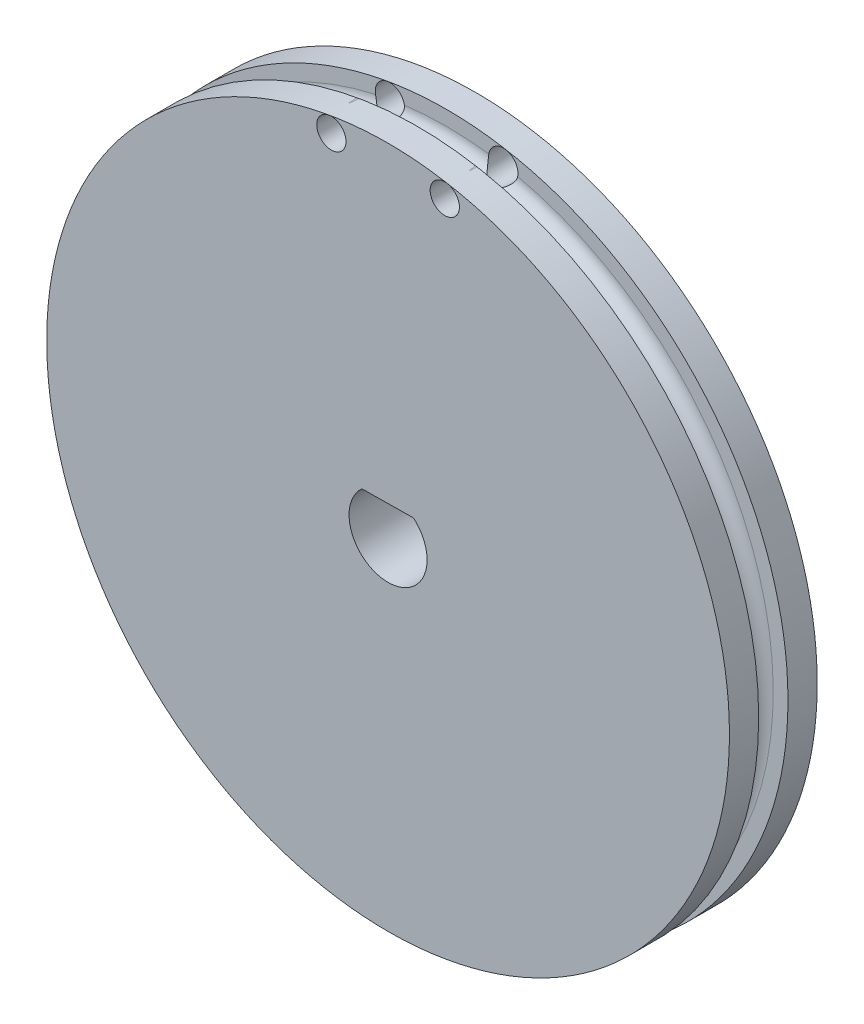
ISO-10303-21;
HEADER;
FILE_DESCRIPTION(('STEP AP214'),'2;1');
FILE_NAME('part.step','',(''),(''),'','','');
FILE_SCHEMA(('AUTOMOTIVE_DESIGN { 1 0 10303 214 1 1 1 1 }'));
ENDSEC;
DATA;
#1=APPLICATION_CONTEXT('core data for automotive mechanical design processes');
#2=APPLICATION_PROTOCOL_DEFINITION('international standard','automotive_design',2000,#1);
#3=PRODUCT_CONTEXT('',#1,'mechanical');
#4=PRODUCT('Part','Part','',(#3));
#5=PRODUCT_RELATED_PRODUCT_CATEGORY('part','',(#4));
#6=PRODUCT_DEFINITION_FORMATION('','',#4);
#7=PRODUCT_DEFINITION_CONTEXT('part definition',#1,'design');
#8=PRODUCT_DEFINITION('design','',#6,#7);
#9=PRODUCT_DEFINITION_SHAPE('','',#8);
#10=(LENGTH_UNIT() NAMED_UNIT(*) SI_UNIT(.MILLI.,.METRE.));
#11=(NAMED_UNIT(*) PLANE_ANGLE_UNIT() SI_UNIT($,.RADIAN.));
#12=(NAMED_UNIT(*) SI_UNIT($,.STERADIAN.) SOLID_ANGLE_UNIT());
#13=UNCERTAINTY_MEASURE_WITH_UNIT(LENGTH_MEASURE(1.E-05),#10,'distance_accuracy_value','');
#14=(GEOMETRIC_REPRESENTATION_CONTEXT(3) GLOBAL_UNCERTAINTY_ASSIGNED_CONTEXT((#13)) GLOBAL_UNIT_ASSIGNED_CONTEXT((#10,
#11,#12)) REPRESENTATION_CONTEXT('',''));
#15=CARTESIAN_POINT('',(0.,0.,0.));
#16=DIRECTION('',(0.,0.,1.));
#17=DIRECTION('',(1.,0.,0.));
#18=AXIS2_PLACEMENT_3D('',#15,#16,#17);
#19=CARTESIAN_POINT('',(0.,0.,0.072036914945138));
#20=DIRECTION('',(0.,0.,1.));
#21=DIRECTION('',(1.,0.,0.));
#22=AXIS2_PLACEMENT_3D('',#19,#20,#21);
#23=TOROIDAL_SURFACE('',#22,33.49,1.5);
#24=CARTESIAN_POINT('',(0.,0.,-1.42796308505486));
#25=DIRECTION('',(0.,0.,1.));
#26=DIRECTION('',(1.,0.,0.));
#27=AXIS2_PLACEMENT_3D('',#24,#25,#26);
#28=CIRCLE('',#27,33.49);
#29=CARTESIAN_POINT('',(-7.28648541423888,32.6877229293826,-1.42796308505486));
#30=VERTEX_POINT('',#29);
#31=CARTESIAN_POINT('',(7.2864854142389,32.6877229293826,-1.42796308505486));
#32=VERTEX_POINT('',#31);
#33=EDGE_CURVE('E110',#30,#32,#28,.T.);
#34=ORIENTED_EDGE('',*,*,#33,.T.);
#35=CARTESIAN_POINT('',(7.22648096329767,33.4902,-1.21465358929825));
#36=CARTESIAN_POINT('',(7.24721869205312,33.4328395210528,-1.24567584346005));
#37=CARTESIAN_POINT('',(7.26486425147668,33.3728237607122,-1.2742841078182));
#38=CARTESIAN_POINT('',(7.2929080779302,33.2481887439241,-1.32546806527203));
#39=CARTESIAN_POINT('',(7.3032550172301,33.1835403384147,-1.34800035855257));
#40=CARTESIAN_POINT('',(7.31535155370406,33.0507981078659,-1.38546382804489));
#41=CARTESIAN_POINT('',(7.31705149249288,32.9826866458258,-1.40035065965318));
#42=CARTESIAN_POINT('',(7.31090815731422,32.8457108822953,-1.42101167318149));
#43=CARTESIAN_POINT('',(7.30309866492471,32.776850101982,-1.42681794613897));
#44=CARTESIAN_POINT('',(7.27917732508329,32.6472919115563,-1.42870604797416));
#45=CARTESIAN_POINT('',(7.26393336563004,32.5864448667168,-1.42566693738849));
#46=CARTESIAN_POINT('',(7.2262795847841,32.4678795178722,-1.41189497819823));
#47=CARTESIAN_POINT('',(7.20386341654656,32.4101640381656,-1.40115530471104));
#48=CARTESIAN_POINT('',(7.15372162882318,32.3010632831311,-1.3731246858763));
#49=CARTESIAN_POINT('',(7.1261781915503,32.2495388830854,-1.35604288782266));
#50=CARTESIAN_POINT('',(7.06651019481577,32.1516279479501,-1.31624732829935));
#51=CARTESIAN_POINT('',(7.03438505333488,32.1052420669446,-1.29353285103261));
#52=CARTESIAN_POINT('',(6.9511180570218,31.9979506741965,-1.23198109790615));
#53=CARTESIAN_POINT('',(6.89799120875655,31.9400874713384,-1.1905179595215));
#54=CARTESIAN_POINT('',(6.78690954216691,31.8357158909392,-1.10032512368079));
#55=CARTESIAN_POINT('',(6.72894243423355,31.789237673078,-1.05157666469472));
#56=CARTESIAN_POINT('',(6.58630761877793,31.690446973773,-0.928319060222554));
#57=CARTESIAN_POINT('',(6.50025221550297,31.6432656388323,-0.851317383773119));
#58=CARTESIAN_POINT('',(6.32597535772955,31.567553882461,-0.691201064312792));
#59=CARTESIAN_POINT('',(6.23775335925808,31.5390281956687,-0.608084875442304));
#60=CARTESIAN_POINT('',(6.05009342686758,31.4961745481403,-0.427655310143903));
#61=CARTESIAN_POINT('',(5.95062462971364,31.484052506684,-0.329861532504301));
#62=CARTESIAN_POINT('',(5.7536390582766,31.4792665885041,-0.132504838536329));
#63=CARTESIAN_POINT('',(5.65611681787094,31.4865370111398,-0.0329490279794932));
#64=CARTESIAN_POINT('',(5.55856031419002,31.5033764723735,0.0683438848832711));
#65=CARTESIAN_POINT('',(5.55678245517445,31.5036866501503,0.0701904224815338));
#66=CARTESIAN_POINT('',(5.55500520356489,31.5040000188606,0.072036914945138));
#67=B_SPLINE_CURVE_WITH_KNOTS('',3,(#35,#36,#37,#38,#39,#40,#41,#42,#43,#44,#45,#46,#47,#48,#49,
#50,#51,#52,#53,#54,#55,#56,#57,#58,#59,#60,#61,#62,#63,#64,#65,#66),.UNSPECIFIED.,.F.,.F.,(4,2,
2,2,2,2,2,2,2,2,2,2,2,2,2,4),(0.,0.205429130324106,0.412288919116181,0.620335341071627,
0.827644844146821,1.01507612157124,1.20267372192072,1.38456670294035,1.56648281065269,
1.83147016781119,2.09715208373175,2.46934660625571,2.84163555183942,3.26020711460503,
3.67736238185017,3.68510835470524),.UNSPECIFIED.);
#68=CARTESIAN_POINT('',(5.55500520356489,31.5040000188606,0.072036914945138));
#69=VERTEX_POINT('',#68);
#70=EDGE_CURVE('E173',#32,#69,#67,.T.);
#71=ORIENTED_EDGE('',*,*,#70,.T.);
#72=CARTESIAN_POINT('',(5.55500520356489,31.5040000188606,0.072036914945138));
#73=CARTESIAN_POINT('',(5.55678242339806,31.5036866560754,0.0738833744220897));
#74=CARTESIAN_POINT('',(5.55856028277175,31.5033764781904,0.0757299123995457));
#75=CARTESIAN_POINT('',(5.67475781249236,31.4833193191819,0.196377800780949));
#76=CARTESIAN_POINT('',(5.79179452078414,31.4767632453832,0.315468701660247));
#77=CARTESIAN_POINT('',(5.96863096673829,31.4878778027493,0.491322098490391));
#78=CARTESIAN_POINT('',(6.02788586003299,31.4951025288359,0.549567030288331));
#79=CARTESIAN_POINT('',(6.14643050189726,31.5169380180936,0.664604191321957));
#80=CARTESIAN_POINT('',(6.2057202055873,31.5315441656644,0.721397305092657));
#81=CARTESIAN_POINT('',(6.34366296533303,31.5748459260209,0.851601860240428));
#82=CARTESIAN_POINT('',(6.42214573217239,31.6066230157377,0.924203439191271));
#83=CARTESIAN_POINT('',(6.57645229331751,31.6856780972382,1.06343911121065));
#84=CARTESIAN_POINT('',(6.6522816907699,31.7329209304747,1.13008630707373));
#85=CARTESIAN_POINT('',(6.78008012920871,31.83044485071,1.2386142196225));
#86=CARTESIAN_POINT('',(6.83323116674128,31.8769316040205,1.28249427349568));
#87=CARTESIAN_POINT('',(6.93480147715806,31.9800466255819,1.36335211178975));
#88=CARTESIAN_POINT('',(6.9832268027114,32.0366616509593,1.40033878200002));
#89=CARTESIAN_POINT('',(7.06402460916213,32.147632574478,1.45864997701456));
#90=CARTESIAN_POINT('',(7.09767188974433,32.2001833751185,1.48162713178441));
#91=CARTESIAN_POINT('',(7.15898236410884,32.3111358162584,1.52041900911282));
#92=CARTESIAN_POINT('',(7.18664900395008,32.3695340589096,1.53623786207783));
#93=CARTESIAN_POINT('',(7.23472573779537,32.4912734062066,1.55969504993786));
#94=CARTESIAN_POINT('',(7.25508953004356,32.5546430491752,1.56728178456987));
#95=CARTESIAN_POINT('',(7.28722593447562,32.6839156840087,1.57351061584644));
#96=CARTESIAN_POINT('',(7.29900515519959,32.7498166859617,1.57215960100484));
#97=CARTESIAN_POINT('',(7.31294060365106,32.8753624281412,1.56129851757934));
#98=CARTESIAN_POINT('',(7.3159226991018,32.9349910404037,1.5525963424387));
#99=CARTESIAN_POINT('',(7.31492361822915,33.052961468389,1.52870870905264));
#100=CARTESIAN_POINT('',(7.31092988123745,33.1113007709957,1.51351159325695));
#101=CARTESIAN_POINT('',(7.29661631120177,33.2251606771127,1.47759064137137));
#102=CARTESIAN_POINT('',(7.28631816938174,33.2806902417418,1.45688589262579));
#103=CARTESIAN_POINT('',(7.26026956138286,33.3881927969625,1.41096058354912));
#104=CARTESIAN_POINT('',(7.24454585240001,33.4401817694268,1.38576247240566));
#105=CARTESIAN_POINT('',(7.22648096329767,33.4902,1.35872741918853));
#106=B_SPLINE_CURVE_WITH_KNOTS('',3,(#72,#73,#74,#75,#76,#77,#78,#79,#80,#81,#82,#83,#84,#85,
#86,#87,#88,#89,#90,#91,#92,#93,#94,#95,#96,#97,#98,#99,#100,#101,#102,#103,#104,#105),
.UNSPECIFIED.,.F.,.F.,(4,2,2,2,2,2,2,2,2,2,2,2,2,2,2,2,4),(0.,0.00774597285507629,
0.506082120849573,0.756051452534892,1.00586467152497,1.33940487252064,1.67219203583541,
1.92076318781905,2.16901167346895,2.36770405482676,2.56628164219278,2.76609688133703,
2.96575813657273,3.14596326206283,3.32649319907702,3.50640546049957,3.68544284085872),.UNSPECIFIED.);
#107=CARTESIAN_POINT('',(7.28648541423892,32.6877229293826,1.57203691494514));
#108=VERTEX_POINT('',#107);
#109=EDGE_CURVE('E170',#69,#108,#106,.T.);
#110=ORIENTED_EDGE('',*,*,#109,.T.);
#111=CARTESIAN_POINT('',(0.,0.,1.57203691494514));
#112=DIRECTION('',(0.,0.,1.));
#113=DIRECTION('',(1.,0.,0.));
#114=AXIS2_PLACEMENT_3D('',#111,#112,#113);
#115=CIRCLE('',#114,33.49);
#116=CARTESIAN_POINT('',(-7.28648541423891,32.6877229293826,1.57203691494514));
#117=VERTEX_POINT('',#116);
#118=EDGE_CURVE('E111',#117,#108,#115,.T.);
#119=ORIENTED_EDGE('',*,*,#118,.F.);
#120=CARTESIAN_POINT('',(-7.22648096329766,33.4902,1.35872741918853));
#121=CARTESIAN_POINT('',(-7.24721866909638,33.4328395845613,1.38974963900976));
#122=CARTESIAN_POINT('',(-7.26486421249063,33.3728238932464,1.41835787451828));
#123=CARTESIAN_POINT('',(-7.29290805522958,33.2481888855221,1.46954184577746));
#124=CARTESIAN_POINT('',(-7.30325501062453,33.1835404108242,1.49207416800194));
#125=CARTESIAN_POINT('',(-7.31535155235554,33.0507981227413,1.52953765374194));
#126=CARTESIAN_POINT('',(-7.3170514917014,32.9826866764046,1.54442448282935));
#127=CARTESIAN_POINT('',(-7.3109081608636,32.8457109135816,1.565085500435));
#128=CARTESIAN_POINT('',(-7.30309866797544,32.7768501178276,1.57089177592221));
#129=CARTESIAN_POINT('',(-7.27917727182139,32.6472916237018,1.57277988194744));
#130=CARTESIAN_POINT('',(-7.26393322246626,32.5864442966346,1.56974073846572));
#131=CARTESIAN_POINT('',(-7.22627937487793,32.4678789763027,1.55596870774485));
#132=CARTESIAN_POINT('',(-7.20386329663502,32.4101637776053,1.54522906748993));
#133=CARTESIAN_POINT('',(-7.15372231171819,32.3010647686668,1.51719889759865));
#134=CARTESIAN_POINT('',(-7.1261797167512,32.249541734675,1.50011766394471));
#135=CARTESIAN_POINT('',(-7.06651197587713,32.1516305211553,1.46032241719157));
#136=CARTESIAN_POINT('',(-7.03438599499773,32.1052432799742,1.43760737720308));
#137=CARTESIAN_POINT('',(-6.95111047050435,31.9979408992708,1.37604931948808));
#138=CARTESIAN_POINT('',(-6.8979748734532,31.9400696824896,1.33457903893624));
#139=CARTESIAN_POINT('',(-6.78689169545137,31.8357015765443,1.24438394663994));
#140=CARTESIAN_POINT('',(-6.72893326581719,31.7892313130465,1.19564257263907));
#141=CARTESIAN_POINT('',(-6.58637226245897,31.6904917606309,1.07244875053378));
#142=CARTESIAN_POINT('',(-6.50038598502388,31.6433390664636,0.995510900193088));
#143=CARTESIAN_POINT('',(-6.32611279001049,31.5675982686807,0.835404376957803));
#144=CARTESIAN_POINT('',(-6.2378219961745,31.5390438630572,0.752224696883452));
#145=CARTESIAN_POINT('',(-6.05015214406152,31.4961879638681,0.571785595859324));
#146=CARTESIAN_POINT('',(-5.95074266748845,31.4840669414593,0.474051404876969));
#147=CARTESIAN_POINT('',(-5.75375524308128,31.4792579030709,0.2766972789028));
#148=CARTESIAN_POINT('',(-5.65617374640469,31.4865271845083,0.177081966613092));
#149=CARTESIAN_POINT('',(-5.55856031410391,31.5033764723876,0.0757299449130578));
#150=CARTESIAN_POINT('',(-5.55678245508592,31.5036866501655,0.0738834073146693));
#151=CARTESIAN_POINT('',(-5.55500520356488,31.5040000188606,0.072036914945138));
#152=B_SPLINE_CURVE_WITH_KNOTS('',3,(#120,#121,#122,#123,#124,#125,#126,#127,#128,#129,#130,
#131,#132,#133,#134,#135,#136,#137,#138,#139,#140,#141,#142,#143,#144,#145,#146,#147,#148,#149,
#150,#151),.UNSPECIFIED.,.F.,.F.,(4,2,2,2,2,2,2,2,2,2,2,2,2,2,2,4),(0.,0.205428904089471,
0.412288918999996,0.620335294250544,0.827644844013994,1.01507699704191,1.20267372163303,
1.38456167807745,1.56648281213321,1.8315108466876,2.09715205583971,2.46905789905693,
2.84163573268954,3.25995942602795,3.67736262085905,3.68510859371465),.UNSPECIFIED.);
#153=CARTESIAN_POINT('',(-5.55500520356488,31.5040000188606,0.072036914945138));
#154=VERTEX_POINT('',#153);
#155=EDGE_CURVE('E49',#117,#154,#152,.T.);
#156=ORIENTED_EDGE('',*,*,#155,.T.);
#157=CARTESIAN_POINT('',(-5.55500520356488,31.5040000188606,0.072036914945138));
#158=CARTESIAN_POINT('',(-5.55678242339835,31.5036866560753,0.0701904554684814));
#159=CARTESIAN_POINT('',(-5.55856028277233,31.5033764781903,0.0683439174913121));
#160=CARTESIAN_POINT('',(-5.67475781251085,31.4833193191787,-0.0523039708714251));
#161=CARTESIAN_POINT('',(-5.79179452078669,31.4767632453826,-0.171394871765637));
#162=CARTESIAN_POINT('',(-5.96863096673494,31.4878778027495,-0.347248268600296));
#163=CARTESIAN_POINT('',(-6.02788586003068,31.4951025288358,-0.405493200396745));
#164=CARTESIAN_POINT('',(-6.14643050189543,31.5169380180931,-0.520530361429015));
#165=CARTESIAN_POINT('',(-6.20572020558492,31.5315441656637,-0.577323475199849));
#166=CARTESIAN_POINT('',(-6.34366296533034,31.57484592602,-0.70752803034805));
#167=CARTESIAN_POINT('',(-6.42214573217012,31.6066230157367,-0.780129609299028));
#168=CARTESIAN_POINT('',(-6.57645229331589,31.6856780972372,-0.919365281318858));
#169=CARTESIAN_POINT('',(-6.65228169076852,31.7329209304738,-0.986012477182253));
#170=CARTESIAN_POINT('',(-6.78008012920762,31.8304448507091,-1.09454038973134));
#171=CARTESIAN_POINT('',(-6.83323116674023,31.8769316040196,-1.13842044360457));
#172=CARTESIAN_POINT('',(-6.93480147715711,31.9800466255809,-1.21927828189875));
#173=CARTESIAN_POINT('',(-6.9832268027105,32.0366616509582,-1.25626495210907));
#174=CARTESIAN_POINT('',(-7.06402460916134,32.1476325744768,-1.31457614712375));
#175=CARTESIAN_POINT('',(-7.0976718897436,32.2001833751173,-1.33755330189365));
#176=CARTESIAN_POINT('',(-7.15898236410823,32.3111358162572,-1.37634517922219));
#177=CARTESIAN_POINT('',(-7.18664900394954,32.3695340589084,-1.39216403218727));
#178=CARTESIAN_POINT('',(-7.23472573779495,32.4912734062054,-1.41562122004742));
#179=CARTESIAN_POINT('',(-7.2550895300432,32.5546430491741,-1.42320795467948));
#180=CARTESIAN_POINT('',(-7.28722593447539,32.6839156840076,-1.42943678595616));
#181=CARTESIAN_POINT('',(-7.29900515519941,32.7498166859607,-1.42808577111461));
#182=CARTESIAN_POINT('',(-7.31294060365097,32.8753624281401,-1.4172246876892));
#183=CARTESIAN_POINT('',(-7.31592269910176,32.9349910404027,-1.40852251254859));
#184=CARTESIAN_POINT('',(-7.31492361822919,33.052961468388,-1.3846348791626));
#185=CARTESIAN_POINT('',(-7.31092988123752,33.1113007709947,-1.36943776336695));
#186=CARTESIAN_POINT('',(-7.2966163112019,33.225160677112,-1.33351681148137));
#187=CARTESIAN_POINT('',(-7.28631816938185,33.2806902417412,-1.31281206273575));
#188=CARTESIAN_POINT('',(-7.26026956138293,33.3881927969622,-1.26688675365899));
#189=CARTESIAN_POINT('',(-7.24454585240005,33.4401817694266,-1.24168864251546));
#190=CARTESIAN_POINT('',(-7.22648096329766,33.4902,-1.21465358929825));
#191=B_SPLINE_CURVE_WITH_KNOTS('',3,(#157,#158,#159,#160,#161,#162,#163,#164,#165,#166,#167,
#168,#169,#170,#171,#172,#173,#174,#175,#176,#177,#178,#179,#180,#181,#182,#183,#184,#185,#186,
#187,#188,#189,#190),.UNSPECIFIED.,.F.,.F.,(4,2,2,2,2,2,2,2,2,2,2,2,2,2,2,2,4),(0.,
0.00774597285507641,0.506082120847678,0.756051452532014,1.00586467152113,1.33940487251785,
1.67219203583373,1.92076318781745,2.16901167346741,2.36770405482533,2.56628164219149,
2.76609688133585,2.96575813657169,3.14596326206182,3.32649319907601,3.50640546049906,
3.68544284085871),.UNSPECIFIED.);
#192=EDGE_CURVE('E107',#154,#30,#191,.T.);
#193=ORIENTED_EDGE('',*,*,#192,.T.);
#194=EDGE_LOOP('',(#34,#71,#110,#119,#156,#193));
#195=FACE_BOUND('',#194,.T.);
#196=ADVANCED_FACE('F34',(#195),#23,.F.);
#197=CARTESIAN_POINT('',(0.,0.,4.57203691494514));
#198=DIRECTION('',(0.,0.,-1.));
#199=DIRECTION('',(-1.,0.,0.));
#200=AXIS2_PLACEMENT_3D('',#197,#198,#199);
#201=PLANE('',#200);
#202=CARTESIAN_POINT('',(5.81547747006528,32.9812116483789,4.57203691494514));
#203=DIRECTION('',(0.,0.,-1.));
#204=DIRECTION('',(-1.,0.,0.));
#205=AXIS2_PLACEMENT_3D('',#202,#203,#204);
#206=CIRCLE('',#205,1.5);
#207=CARTESIAN_POINT('',(4.31547747006528,32.9812116483789,4.57203691494514));
#208=VERTEX_POINT('',#207);
#209=EDGE_CURVE('E206',#208,#208,#206,.T.);
#210=ORIENTED_EDGE('',*,*,#209,.T.);
#211=EDGE_LOOP('',(#210));
#212=FACE_BOUND('',#211,.T.);
#213=CARTESIAN_POINT('',(-5.81547747006526,32.9812116483789,4.57203691494514));
#214=DIRECTION('',(0.,0.,-1.));
#215=DIRECTION('',(-1.,0.,0.));
#216=AXIS2_PLACEMENT_3D('',#213,#214,#215);
#217=CIRCLE('',#216,1.5);
#218=CARTESIAN_POINT('',(-7.31547747006527,32.9812116483789,4.57203691494514));
#219=VERTEX_POINT('',#218);
#220=EDGE_CURVE('E175',#219,#219,#217,.T.);
#221=ORIENTED_EDGE('',*,*,#220,.T.);
#222=EDGE_LOOP('',(#221));
#223=FACE_BOUND('',#222,.T.);
#224=DIRECTION('',(0.999941658436289,0.0108018389028612,0.));
#225=VECTOR('',#224,1.);
#226=CARTESIAN_POINT('',(2.61319143708733,3.02840395474802,4.57203691494514));
#227=LINE('',#226,#225);
#228=CARTESIAN_POINT('',(-2.6780024705045,2.97124599586971,4.57203691494514));
#229=VERTEX_POINT('',#228);
#230=CARTESIAN_POINT('',(2.61319143708733,3.02840395474802,4.57203691494514));
#231=VERTEX_POINT('',#230);
#232=EDGE_CURVE('E213',#229,#231,#227,.T.);
#233=ORIENTED_EDGE('',*,*,#232,.T.);
#234=CARTESIAN_POINT('',(0.,0.,4.57203691494514));
#235=DIRECTION('',(0.,0.,-1.));
#236=DIRECTION('',(-1.,0.,0.));
#237=AXIS2_PLACEMENT_3D('',#234,#235,#236);
#238=CIRCLE('',#237,4.);
#239=EDGE_CURVE('E210',#231,#229,#238,.T.);
#240=ORIENTED_EDGE('',*,*,#239,.T.);
#241=EDGE_LOOP('',(#233,#240));
#242=FACE_BOUND('',#241,.T.);
#243=CARTESIAN_POINT('',(0.,0.,4.57203691494514));
#244=DIRECTION('',(0.,0.,1.));
#245=DIRECTION('',(1.,0.,0.));
#246=AXIS2_PLACEMENT_3D('',#243,#244,#245);
#247=CIRCLE('',#246,35.);
#248=CARTESIAN_POINT('',(35.,0.,4.57203691494514));
#249=VERTEX_POINT('',#248);
#250=EDGE_CURVE('E223',#249,#249,#247,.T.);
#251=ORIENTED_EDGE('',*,*,#250,.T.);
#252=EDGE_LOOP('',(#251));
#253=FACE_BOUND('',#252,.T.);
#254=ADVANCED_FACE('F36',(#212,#223,#242,#253),#201,.F.);
#255=CARTESIAN_POINT('',(0.,0.,-4.42796308505486));
#256=DIRECTION('',(0.,0.,1.));
#257=DIRECTION('',(1.,0.,0.));
#258=AXIS2_PLACEMENT_3D('',#255,#256,#257);
#259=PLANE('',#258);
#260=CARTESIAN_POINT('',(5.81547747006528,32.9812116483789,-4.42796308505486));
#261=DIRECTION('',(0.,0.,-1.));
#262=DIRECTION('',(-1.,0.,0.));
#263=AXIS2_PLACEMENT_3D('',#260,#261,#262);
#264=CIRCLE('',#263,1.5);
#265=CARTESIAN_POINT('',(4.31547747006528,32.9812116483789,-4.42796308505486));
#266=VERTEX_POINT('',#265);
#267=EDGE_CURVE('E266',#266,#266,#264,.T.);
#268=ORIENTED_EDGE('',*,*,#267,.F.);
#269=EDGE_LOOP('',(#268));
#270=FACE_BOUND('',#269,.T.);
#271=CARTESIAN_POINT('',(-5.81547747006526,32.9812116483789,-4.42796308505486));
#272=DIRECTION('',(0.,0.,-1.));
#273=DIRECTION('',(-1.,0.,0.));
#274=AXIS2_PLACEMENT_3D('',#271,#272,#273);
#275=CIRCLE('',#274,1.5);
#276=CARTESIAN_POINT('',(-7.31547747006527,32.9812116483789,-4.42796308505486));
#277=VERTEX_POINT('',#276);
#278=EDGE_CURVE('E263',#277,#277,#275,.T.);
#279=ORIENTED_EDGE('',*,*,#278,.F.);
#280=EDGE_LOOP('',(#279));
#281=FACE_BOUND('',#280,.T.);
#282=DIRECTION('',(0.999941658436289,0.0108018389028612,0.));
#283=VECTOR('',#282,1.);
#284=CARTESIAN_POINT('',(2.61319143708733,3.02840395474802,-4.42796308505486));
#285=LINE('',#284,#283);
#286=CARTESIAN_POINT('',(-2.6780024705045,2.97124599586971,-4.42796308505486));
#287=VERTEX_POINT('',#286);
#288=CARTESIAN_POINT('',(2.61319143708733,3.02840395474802,-4.42796308505486));
#289=VERTEX_POINT('',#288);
#290=EDGE_CURVE('E214',#287,#289,#285,.T.);
#291=ORIENTED_EDGE('',*,*,#290,.F.);
#292=CARTESIAN_POINT('',(0.,0.,-4.42796308505486));
#293=DIRECTION('',(0.,0.,-1.));
#294=DIRECTION('',(-1.,0.,0.));
#295=AXIS2_PLACEMENT_3D('',#292,#293,#294);
#296=CIRCLE('',#295,4.);
#297=EDGE_CURVE('E209',#289,#287,#296,.T.);
#298=ORIENTED_EDGE('',*,*,#297,.F.);
#299=EDGE_LOOP('',(#291,#298));
#300=FACE_BOUND('',#299,.T.);
#301=CARTESIAN_POINT('',(0.,0.,-4.42796308505486));
#302=DIRECTION('',(0.,0.,1.));
#303=DIRECTION('',(1.,0.,0.));
#304=AXIS2_PLACEMENT_3D('',#301,#302,#303);
#305=CIRCLE('',#304,35.);
#306=CARTESIAN_POINT('',(35.,0.,-4.42796308505486));
#307=VERTEX_POINT('',#306);
#308=EDGE_CURVE('E100',#307,#307,#305,.T.);
#309=ORIENTED_EDGE('',*,*,#308,.F.);
#310=EDGE_LOOP('',(#309));
#311=FACE_BOUND('',#310,.T.);
#312=ADVANCED_FACE('F128',(#270,#281,#300,#311),#259,.F.);
#313=CARTESIAN_POINT('',(0.,0.,4.57203691494514));
#314=DIRECTION('',(0.,0.,1.));
#315=DIRECTION('',(1.,0.,0.));
#316=AXIS2_PLACEMENT_3D('',#313,#314,#315);
#317=CYLINDRICAL_SURFACE('',#316,35.);
#318=CARTESIAN_POINT('',(0.,0.,-1.42796308505486));
#319=DIRECTION('',(0.,0.,1.));
#320=DIRECTION('',(1.,0.,0.));
#321=AXIS2_PLACEMENT_3D('',#318,#319,#320);
#322=CIRCLE('',#321,35.);
#323=CARTESIAN_POINT('',(35.,0.,-1.42796308505486));
#324=VERTEX_POINT('',#323);
#325=EDGE_CURVE('E120',#324,#324,#322,.T.);
#326=ORIENTED_EDGE('',*,*,#325,.F.);
#327=EDGE_LOOP('',(#326));
#328=FACE_BOUND('',#327,.T.);
#329=ORIENTED_EDGE('',*,*,#308,.T.);
#330=EDGE_LOOP('',(#329));
#331=FACE_BOUND('',#330,.T.);
#332=ADVANCED_FACE('F126',(#328,#331),#317,.T.);
#333=CARTESIAN_POINT('',(0.,33.49,-1.42796308505486));
#334=DIRECTION('',(0.,0.,-1.));
#335=DIRECTION('',(-1.,0.,0.));
#336=AXIS2_PLACEMENT_3D('',#333,#334,#335);
#337=PLANE('',#336);
#338=CARTESIAN_POINT('',(4.33280310607228,33.2085368127536,-1.42796308505486));
#339=VERTEX_POINT('',#338);
#340=CARTESIAN_POINT('',(-4.33280310607309,33.2085368127589,-1.42796308505486));
#341=VERTEX_POINT('',#340);
#342=EDGE_CURVE('E114',#339,#341,#28,.T.);
#343=ORIENTED_EDGE('',*,*,#342,.F.);
#344=CARTESIAN_POINT('',(5.81547747006528,32.9812116483789,-1.42796308505486));
#345=DIRECTION('',(0.,0.,-1.));
#346=DIRECTION('',(-1.,0.,0.));
#347=AXIS2_PLACEMENT_3D('',#344,#345,#346);
#348=CIRCLE('',#347,1.5);
#349=EDGE_CURVE('E165',#339,#32,#348,.T.);
#350=ORIENTED_EDGE('',*,*,#349,.T.);
#351=ORIENTED_EDGE('',*,*,#33,.F.);
#352=CARTESIAN_POINT('',(-5.81547747006526,32.9812116483789,-1.42796308505486));
#353=DIRECTION('',(0.,0.,-1.));
#354=DIRECTION('',(-1.,0.,0.));
#355=AXIS2_PLACEMENT_3D('',#352,#353,#354);
#356=CIRCLE('',#355,1.5);
#357=EDGE_CURVE('E166',#30,#341,#356,.T.);
#358=ORIENTED_EDGE('',*,*,#357,.T.);
#359=EDGE_LOOP('',(#343,#350,#351,#358));
#360=FACE_BOUND('',#359,.T.);
#361=ORIENTED_EDGE('',*,*,#325,.T.);
#362=EDGE_LOOP('',(#361));
#363=FACE_BOUND('',#362,.T.);
#364=ADVANCED_FACE('F135',(#360,#363),#337,.F.);
#365=CARTESIAN_POINT('',(4.40447397683288,33.4902,1.54401449404221));
#366=CARTESIAN_POINT('',(4.39411904428903,33.4614998675357,1.54985970039449));
#367=CARTESIAN_POINT('',(4.38459089721339,33.4323338317181,1.55482915879839));
#368=CARTESIAN_POINT('',(4.367283166605,33.3732343564512,1.56294056248139));
#369=CARTESIAN_POINT('',(4.35950387855967,33.34330078827,1.5660821990737));
#370=CARTESIAN_POINT('',(4.3389995217563,33.2528873407851,1.57262871475578));
#371=CARTESIAN_POINT('',(4.32901135088543,33.1915285168171,1.57321010751522));
#372=CARTESIAN_POINT('',(4.31673150520435,33.0683991399998,1.56667930833802));
#373=CARTESIAN_POINT('',(4.31445137741098,33.0066281082101,1.55955559483552));
#374=CARTESIAN_POINT('',(4.31734953207472,32.8845553720855,1.53807500113909));
#375=CARTESIAN_POINT('',(4.32252894991549,32.8242538928454,1.52371702006634));
#376=CARTESIAN_POINT('',(4.33964805417534,32.7064778593117,1.48861974780413));
#377=CARTESIAN_POINT('',(4.35159863215251,32.6490080220615,1.46787020024074));
#378=CARTESIAN_POINT('',(4.38132906016638,32.537890883527,1.42103756631986));
#379=CARTESIAN_POINT('',(4.39911317434767,32.4842464134996,1.39495058371735));
#380=CARTESIAN_POINT('',(4.45031448140135,32.3539137424034,1.32343052060663));
#381=CARTESIAN_POINT('',(4.4870188070368,32.2801108520567,1.27507915984688));
#382=CARTESIAN_POINT('',(4.56894928704128,32.143012972979,1.1712076950511));
#383=CARTESIAN_POINT('',(4.61419599062519,32.0797440296713,1.11567040835702));
#384=CARTESIAN_POINT('',(4.73060247239512,31.9398900003813,0.976145534638553));
#385=CARTESIAN_POINT('',(4.80483641527219,31.8682861725863,0.889743600840368));
#386=CARTESIAN_POINT('',(4.96161358700319,31.743898550163,0.71128921393226));
#387=CARTESIAN_POINT('',(5.04416443555706,31.691132218668,0.61923160995009));
#388=CARTESIAN_POINT('',(5.19669056652393,31.6127110752984,0.452154891870196));
#389=CARTESIAN_POINT('',(5.26558498378577,31.5836725783903,0.377697096659499));
#390=CARTESIAN_POINT('',(5.40591831048507,31.5363129320145,0.228001245572818));
#391=CARTESIAN_POINT('',(5.47735211081127,31.5179714266691,0.152764950789006));
#392=CARTESIAN_POINT('',(5.55145121775142,31.5046299940147,0.0757299538388958));
#393=CARTESIAN_POINT('',(5.55322794581817,31.5043134020565,0.0738834161965858));
#394=CARTESIAN_POINT('',(5.55500520356489,31.5040000188606,0.072036914945138));
#395=B_SPLINE_CURVE_WITH_KNOTS('',3,(#365,#366,#367,#368,#369,#370,#371,#372,#373,#374,#375,
#376,#377,#378,#379,#380,#381,#382,#383,#384,#385,#386,#387,#388,#389,#390,#391,#392,#393,#394),
.UNSPECIFIED.,.F.,.F.,(4,2,2,2,2,2,2,2,2,2,2,2,2,2,4),(0.,0.0931479344408366,0.186311595358299,
0.371785102365388,0.557536334715062,0.74331584240647,0.92939503229342,1.11561054487642,
1.40068389577567,1.68645195348649,2.08793051283503,2.4897802986964,2.80578386854158,
3.12118411946695,3.12893009232202),.UNSPECIFIED.);
#396=CARTESIAN_POINT('',(4.33280310607227,33.2085368127536,1.57203691494514));
#397=VERTEX_POINT('',#396);
#398=EDGE_CURVE('E57',#397,#69,#395,.T.);
#399=ORIENTED_EDGE('',*,*,#398,.T.);
#400=CARTESIAN_POINT('',(5.55500520356489,31.5040000188606,0.072036914945138));
#401=CARTESIAN_POINT('',(5.5532279868164,31.5043133991459,0.0701904554679222));
#402=CARTESIAN_POINT('',(5.5514512583971,31.5046299909941,0.0683439174908536));
#403=CARTESIAN_POINT('',(5.43540185095507,31.5255242313175,-0.0523034445975354));
#404=CARTESIAN_POINT('',(5.32318150119548,31.5593922398663,-0.171393813983669));
#405=CARTESIAN_POINT('',(5.16081118693174,31.6303178493603,-0.34724697590791));
#406=CARTESIAN_POINT('',(5.10760055197537,31.6573733120444,-0.405492173817613));
#407=CARTESIAN_POINT('',(5.00367272210164,31.7184368247983,-0.520529856742711));
#408=CARTESIAN_POINT('',(4.95295399076258,31.7524405223665,-0.577323226273348));
#409=CARTESIAN_POINT('',(4.8381389709126,31.8403110603688,-0.707529255721092));
#410=CARTESIAN_POINT('',(4.77525670419442,31.8970154786874,-0.780132003608107));
#411=CARTESIAN_POINT('',(4.65729465810588,32.0240793789472,-0.919367479158029));
#412=CARTESIAN_POINT('',(4.60219733682534,32.0944072860683,-0.986013500413324));
#413=CARTESIAN_POINT('',(4.51546353685184,32.2297557552176,-1.09453851644284));
#414=CARTESIAN_POINT('',(4.48141854559865,32.2916150177209,-1.13841690208375));
#415=CARTESIAN_POINT('',(4.42124049752309,32.4232500484466,-1.21927527368136));
#416=CARTESIAN_POINT('',(4.39509785883228,32.4930160870892,-1.25626359301102));
#417=CARTESIAN_POINT('',(4.35712479551881,32.6249358829768,-1.31457808028659));
#418=CARTESIAN_POINT('',(4.34347919194201,32.6858296244434,-1.33755679029777));
#419=CARTESIAN_POINT('',(4.32381576188084,32.8110622546353,-1.37634737566926));
#420=CARTESIAN_POINT('',(4.31779242267993,32.8753986183818,-1.39216442529632));
#421=CARTESIAN_POINT('',(4.31425066364818,33.0062296043342,-1.4156218035825));
#422=CARTESIAN_POINT('',(4.31678620398189,33.0727352920446,-1.42320985435589));
#423=CARTESIAN_POINT('',(4.33080875783648,33.2052244698104,-1.42943501558424));
#424=CARTESIAN_POINT('',(4.34228868873009,33.2712083313326,-1.42807920191006));
#425=CARTESIAN_POINT('',(4.36436862107697,33.3620351060004,-1.42004632272367));
#426=CARTESIAN_POINT('',(4.37147581815217,33.3881363448135,-1.41698937961559));
#427=CARTESIAN_POINT('',(4.38700544262834,33.4396741358507,-1.40948851183704));
#428=CARTESIAN_POINT('',(4.39542474972969,33.4651121020278,-1.40504785333308));
#429=CARTESIAN_POINT('',(4.40447397683288,33.4902,-1.39994066415193));
#430=B_SPLINE_CURVE_WITH_KNOTS('',3,(#400,#401,#402,#403,#404,#405,#406,#407,#408,#409,#410,
#411,#412,#413,#414,#415,#416,#417,#418,#419,#420,#421,#422,#423,#424,#425,#426,#427,#428,#429),
.UNSPECIFIED.,.F.,.F.,(4,2,2,2,2,2,2,2,2,2,2,2,2,2,4),(0.,0.00774597285507611,0.506079913487095,
0.756050349564295,1.00586467698823,1.33941035889877,1.67219204475636,1.92075316477991,
2.16901167581976,2.36771856082881,2.56628165104064,2.76609893079053,2.96575814557692,
3.04736966932739,3.12878999549764),.UNSPECIFIED.);
#431=EDGE_CURVE('E168',#69,#339,#430,.T.);
#432=ORIENTED_EDGE('',*,*,#431,.T.);
#433=ORIENTED_EDGE('',*,*,#342,.T.);
#434=CARTESIAN_POINT('',(-4.40447397683286,33.4902,-1.39994066415194));
#435=CARTESIAN_POINT('',(-4.39411904428901,33.4614998675357,-1.40578587050421));
#436=CARTESIAN_POINT('',(-4.38459089721337,33.4323338317181,-1.41075532890811));
#437=CARTESIAN_POINT('',(-4.36728316660499,33.3732343564512,-1.41886673259111));
#438=CARTESIAN_POINT('',(-4.35950387855965,33.34330078827,-1.42200836918342));
#439=CARTESIAN_POINT('',(-4.33899952175629,33.2528873407851,-1.4285548848655));
#440=CARTESIAN_POINT('',(-4.32901135088541,33.1915285168171,-1.42913627762494));
#441=CARTESIAN_POINT('',(-4.31673150520434,33.0683991399998,-1.42260547844774));
#442=CARTESIAN_POINT('',(-4.31445137741096,33.0066281082101,-1.41548176494524));
#443=CARTESIAN_POINT('',(-4.31734953207471,32.8845553720855,-1.39400117124881));
#444=CARTESIAN_POINT('',(-4.32252894991548,32.8242538928454,-1.37964319017606));
#445=CARTESIAN_POINT('',(-4.33964805417533,32.7064778593117,-1.34454591791385));
#446=CARTESIAN_POINT('',(-4.3515986321525,32.6490080220615,-1.32379637035046));
#447=CARTESIAN_POINT('',(-4.38132906016637,32.537890883527,-1.27696373642958));
#448=CARTESIAN_POINT('',(-4.39911317434766,32.4842464134996,-1.25087675382707));
#449=CARTESIAN_POINT('',(-4.45031448140134,32.3539137424034,-1.17935669071635));
#450=CARTESIAN_POINT('',(-4.48701880703678,32.2801108520567,-1.13100532995659));
#451=CARTESIAN_POINT('',(-4.56894928704129,32.143012972979,-1.02713386516082));
#452=CARTESIAN_POINT('',(-4.61419599062523,32.0797440296713,-0.971596578466767));
#453=CARTESIAN_POINT('',(-4.73060247239505,31.9398900003814,-0.83207170474822));
#454=CARTESIAN_POINT('',(-4.80483641527194,31.8682861725863,-0.745669770949866));
#455=CARTESIAN_POINT('',(-4.96161358700341,31.7438985501629,-0.567215384042237));
#456=CARTESIAN_POINT('',(-5.04416443555795,31.6911322186679,-0.475157780060713));
#457=CARTESIAN_POINT('',(-5.19669056652323,31.6127110752985,-0.308081061979217));
#458=CARTESIAN_POINT('',(-5.2655849837834,31.5836725783907,-0.233623266766862));
#459=CARTESIAN_POINT('',(-5.40591831048744,31.536312932014,-0.0839274156848967));
#460=CARTESIAN_POINT('',(-5.47735211082003,31.5179714266675,-0.00869112090744289));
#461=CARTESIAN_POINT('',(-5.55145121775184,31.5046299940146,0.0683438760509567));
#462=CARTESIAN_POINT('',(-5.55322794581838,31.5043134020564,0.070190413693474));
#463=CARTESIAN_POINT('',(-5.55500520356488,31.5040000188606,0.072036914945138));
#464=B_SPLINE_CURVE_WITH_KNOTS('',3,(#434,#435,#436,#437,#438,#439,#440,#441,#442,#443,#444,
#445,#446,#447,#448,#449,#450,#451,#452,#453,#454,#455,#456,#457,#458,#459,#460,#461,#462,#463),
.UNSPECIFIED.,.F.,.F.,(4,2,2,2,2,2,2,2,2,2,2,2,2,2,4),(0.,0.0931479344408368,0.186311595358306,
0.371785102365387,0.557536334715069,0.74331584240647,0.92939503229342,1.11561054487642,
1.40068389577569,1.6864519534865,2.08793051283501,2.4897802986964,2.80578386854159,
3.12118411946694,3.12893009232202),.UNSPECIFIED.);
#465=EDGE_CURVE('E106',#341,#154,#464,.T.);
#466=ORIENTED_EDGE('',*,*,#465,.T.);
#467=CARTESIAN_POINT('',(-5.55500520356488,31.5040000188606,0.072036914945138));
#468=CARTESIAN_POINT('',(-5.55322798681674,31.5043133991458,0.0738833744227079));
#469=CARTESIAN_POINT('',(-5.55145125839779,31.504629990994,0.0757299124001206));
#470=CARTESIAN_POINT('',(-5.43540185097724,31.5255242313135,0.196377274510896));
#471=CARTESIAN_POINT('',(-5.32318150119862,31.5593922398658,0.315467643879171));
#472=CARTESIAN_POINT('',(-5.16081118692793,31.6303178493615,0.491320805797985));
#473=CARTESIAN_POINT('',(-5.10760055197286,31.6573733120455,0.549566003709465));
#474=CARTESIAN_POINT('',(-5.00367272209983,31.7184368247997,0.664603686636182));
#475=CARTESIAN_POINT('',(-4.95295399076018,31.7524405223683,0.721397056166662));
#476=CARTESIAN_POINT('',(-4.83813897090996,31.8403110603709,0.851603085613897));
#477=CARTESIAN_POINT('',(-4.77525670419227,31.8970154786894,0.924205833500752));
#478=CARTESIAN_POINT('',(-4.65729465810446,32.024079378949,1.06344130905013));
#479=CARTESIAN_POINT('',(-4.60219733682418,32.0944072860699,1.13008733030504));
#480=CARTESIAN_POINT('',(-4.51546353685098,32.229755755219,1.23861234633417));
#481=CARTESIAN_POINT('',(-4.48141854559787,32.2916150177224,1.28249073197502));
#482=CARTESIAN_POINT('',(-4.42124049752245,32.4232500484482,1.36334910357251));
#483=CARTESIAN_POINT('',(-4.39509785883172,32.4930160870908,1.4003374229021));
#484=CARTESIAN_POINT('',(-4.3571247955184,32.6249358829784,1.45865191017751));
#485=CARTESIAN_POINT('',(-4.34347919194167,32.685829624445,1.48163062018862));
#486=CARTESIAN_POINT('',(-4.32381576188065,32.8110622546369,1.52042120555996));
#487=CARTESIAN_POINT('',(-4.31779242267981,32.8753986183833,1.53623825518695));
#488=CARTESIAN_POINT('',(-4.3142506636482,33.0062296043357,1.55969563347297));
#489=CARTESIAN_POINT('',(-4.31678620398196,33.072735292046,1.5672836842463));
#490=CARTESIAN_POINT('',(-4.33080875783667,33.2052244698117,1.57350884547452));
#491=CARTESIAN_POINT('',(-4.34228868873032,33.2712083313339,1.57215303180028));
#492=CARTESIAN_POINT('',(-4.36436862107722,33.3620351060014,1.56412015261383));
#493=CARTESIAN_POINT('',(-4.37147581815238,33.3881363448142,1.56106320950576));
#494=CARTESIAN_POINT('',(-4.38700544262845,33.4396741358511,1.55356234172725));
#495=CARTESIAN_POINT('',(-4.39542474972974,33.465112102028,1.54912168322332));
#496=CARTESIAN_POINT('',(-4.40447397683286,33.4902,1.54401449404221));
#497=B_SPLINE_CURVE_WITH_KNOTS('',3,(#467,#468,#469,#470,#471,#472,#473,#474,#475,#476,#477,
#478,#479,#480,#481,#482,#483,#484,#485,#486,#487,#488,#489,#490,#491,#492,#493,#494,#495,#496),
.UNSPECIFIED.,.F.,.F.,(4,2,2,2,2,2,2,2,2,2,2,2,2,2,4),(0.,0.00774597285507664,0.506079913489356,
0.756050349567742,1.00586467699284,1.33941035890211,1.67219204475838,1.92075316478182,
2.1690116758216,2.36771856083049,2.56628165104216,2.7660989307919,2.96575814557813,
3.04736966932799,3.12878999549763),.UNSPECIFIED.);
#498=CARTESIAN_POINT('',(-4.33280310607225,33.2085368127536,1.57203691494514));
#499=VERTEX_POINT('',#498);
#500=EDGE_CURVE('E94',#154,#499,#497,.T.);
#501=ORIENTED_EDGE('',*,*,#500,.T.);
#502=EDGE_CURVE('E104',#397,#499,#115,.T.);
#503=ORIENTED_EDGE('',*,*,#502,.F.);
#504=EDGE_LOOP('',(#399,#432,#433,#466,#501,#503));
#505=FACE_BOUND('',#504,.T.);
#506=ADVANCED_FACE('F103',(#505),#23,.F.);
#507=CARTESIAN_POINT('',(0.,35.,1.57203691494514));
#508=DIRECTION('',(0.,0.,1.));
#509=DIRECTION('',(1.,0.,0.));
#510=AXIS2_PLACEMENT_3D('',#507,#508,#509);
#511=PLANE('',#510);
#512=CARTESIAN_POINT('',(0.,0.,1.57203691494514));
#513=DIRECTION('',(0.,0.,1.));
#514=DIRECTION('',(1.,0.,0.));
#515=AXIS2_PLACEMENT_3D('',#512,#513,#514);
#516=CIRCLE('',#515,35.);
#517=CARTESIAN_POINT('',(35.,0.,1.57203691494514));
#518=VERTEX_POINT('',#517);
#519=EDGE_CURVE('E116',#518,#518,#516,.T.);
#520=ORIENTED_EDGE('',*,*,#519,.F.);
#521=EDGE_LOOP('',(#520));
#522=FACE_BOUND('',#521,.T.);
#523=ORIENTED_EDGE('',*,*,#118,.T.);
#524=CARTESIAN_POINT('',(5.81547747006528,32.9812116483789,1.57203691494514));
#525=DIRECTION('',(0.,0.,1.));
#526=DIRECTION('',(1.,0.,0.));
#527=AXIS2_PLACEMENT_3D('',#524,#525,#526);
#528=CIRCLE('',#527,1.5);
#529=EDGE_CURVE('E11',#108,#397,#528,.T.);
#530=ORIENTED_EDGE('',*,*,#529,.T.);
#531=ORIENTED_EDGE('',*,*,#502,.T.);
#532=CARTESIAN_POINT('',(-5.81547747006526,32.9812116483789,1.57203691494514));
#533=DIRECTION('',(0.,0.,1.));
#534=DIRECTION('',(1.,0.,0.));
#535=AXIS2_PLACEMENT_3D('',#532,#533,#534);
#536=CIRCLE('',#535,1.5);
#537=EDGE_CURVE('E42',#499,#117,#536,.T.);
#538=ORIENTED_EDGE('',*,*,#537,.T.);
#539=EDGE_LOOP('',(#523,#530,#531,#538));
#540=FACE_BOUND('',#539,.T.);
#541=ADVANCED_FACE('F109',(#522,#540),#511,.F.);
#542=CARTESIAN_POINT('',(0.,0.,4.57203691494514));
#543=DIRECTION('',(0.,0.,1.));
#544=DIRECTION('',(1.,0.,0.));
#545=AXIS2_PLACEMENT_3D('',#542,#543,#544);
#546=CYLINDRICAL_SURFACE('',#545,35.);
#547=ORIENTED_EDGE('',*,*,#250,.F.);
#548=EDGE_LOOP('',(#547));
#549=FACE_BOUND('',#548,.T.);
#550=ORIENTED_EDGE('',*,*,#519,.T.);
#551=EDGE_LOOP('',(#550));
#552=FACE_BOUND('',#551,.T.);
#553=ADVANCED_FACE('F154',(#549,#552),#546,.T.);
#554=CARTESIAN_POINT('',(0.,0.,4.57203691494514));
#555=DIRECTION('',(0.,0.,-1.));
#556=DIRECTION('',(-1.,0.,0.));
#557=AXIS2_PLACEMENT_3D('',#554,#555,#556);
#558=CYLINDRICAL_SURFACE('',#557,4.);
#559=ORIENTED_EDGE('',*,*,#297,.T.);
#560=DIRECTION('',(0.,0.,-1.));
#561=VECTOR('',#560,1.);
#562=CARTESIAN_POINT('',(-2.6780024705045,2.97124599586971,4.57203691494514));
#563=LINE('',#562,#561);
#564=EDGE_CURVE('E217',#229,#287,#563,.T.);
#565=ORIENTED_EDGE('',*,*,#564,.F.);
#566=ORIENTED_EDGE('',*,*,#239,.F.);
#567=DIRECTION('',(0.,0.,-1.));
#568=VECTOR('',#567,1.);
#569=CARTESIAN_POINT('',(2.61319143708733,3.02840395474802,4.57203691494514));
#570=LINE('',#569,#568);
#571=EDGE_CURVE('E221',#231,#289,#570,.T.);
#572=ORIENTED_EDGE('',*,*,#571,.T.);
#573=EDGE_LOOP('',(#559,#565,#566,#572));
#574=FACE_BOUND('',#573,.T.);
#575=ADVANCED_FACE('F232',(#574),#558,.F.);
#576=CARTESIAN_POINT('',(2.61319143708733,3.02840395474802,4.57203691494514));
#577=DIRECTION('',(-0.0108018389028612,0.999941658436289,0.));
#578=DIRECTION('',(-0.999941658436289,-0.0108018389028612,0.));
#579=AXIS2_PLACEMENT_3D('',#576,#577,#578);
#580=PLANE('',#579);
#581=ORIENTED_EDGE('',*,*,#290,.T.);
#582=ORIENTED_EDGE('',*,*,#571,.F.);
#583=ORIENTED_EDGE('',*,*,#232,.F.);
#584=ORIENTED_EDGE('',*,*,#564,.T.);
#585=EDGE_LOOP('',(#581,#582,#583,#584));
#586=FACE_BOUND('',#585,.T.);
#587=ADVANCED_FACE('F238',(#586),#580,.F.);
#588=CARTESIAN_POINT('',(-5.81547747006526,32.9812116483789,29.0620369149451));
#589=DIRECTION('',(0.,0.,-1.));
#590=DIRECTION('',(-1.,0.,0.));
#591=AXIS2_PLACEMENT_3D('',#588,#589,#590);
#592=CYLINDRICAL_SURFACE('',#591,1.5);
#593=ORIENTED_EDGE('',*,*,#155,.F.);
#594=ORIENTED_EDGE('',*,*,#537,.F.);
#595=ORIENTED_EDGE('',*,*,#500,.F.);
#596=EDGE_LOOP('',(#593,#594,#595));
#597=FACE_BOUND('',#596,.T.);
#598=ORIENTED_EDGE('',*,*,#220,.F.);
#599=EDGE_LOOP('',(#598));
#600=FACE_BOUND('',#599,.T.);
#601=ADVANCED_FACE('F92',(#597,#600),#592,.F.);
#602=CARTESIAN_POINT('',(5.81547747006528,32.9812116483789,29.0620369149451));
#603=DIRECTION('',(0.,0.,-1.));
#604=DIRECTION('',(-1.,0.,0.));
#605=AXIS2_PLACEMENT_3D('',#602,#603,#604);
#606=CYLINDRICAL_SURFACE('',#605,1.5);
#607=ORIENTED_EDGE('',*,*,#398,.F.);
#608=ORIENTED_EDGE('',*,*,#529,.F.);
#609=ORIENTED_EDGE('',*,*,#109,.F.);
#610=EDGE_LOOP('',(#607,#608,#609));
#611=FACE_BOUND('',#610,.T.);
#612=ORIENTED_EDGE('',*,*,#209,.F.);
#613=EDGE_LOOP('',(#612));
#614=FACE_BOUND('',#613,.T.);
#615=ADVANCED_FACE('F189',(#611,#614),#606,.F.);
#616=ORIENTED_EDGE('',*,*,#278,.T.);
#617=EDGE_LOOP('',(#616));
#618=FACE_BOUND('',#617,.T.);
#619=ORIENTED_EDGE('',*,*,#192,.F.);
#620=ORIENTED_EDGE('',*,*,#465,.F.);
#621=ORIENTED_EDGE('',*,*,#357,.F.);
#622=EDGE_LOOP('',(#619,#620,#621));
#623=FACE_BOUND('',#622,.T.);
#624=ADVANCED_FACE('F193',(#618,#623),#592,.F.);
#625=ORIENTED_EDGE('',*,*,#267,.T.);
#626=EDGE_LOOP('',(#625));
#627=FACE_BOUND('',#626,.T.);
#628=ORIENTED_EDGE('',*,*,#431,.F.);
#629=ORIENTED_EDGE('',*,*,#70,.F.);
#630=ORIENTED_EDGE('',*,*,#349,.F.);
#631=EDGE_LOOP('',(#628,#629,#630));
#632=FACE_BOUND('',#631,.T.);
#633=ADVANCED_FACE('F194',(#627,#632),#606,.F.);
#634=CLOSED_SHELL('',(#196,#254,#312,#332,#364,#506,#541,#553,#575,#587,#601,#615,#624,#633));
#635=MANIFOLD_SOLID_BREP('B2',#634);
#636=ADVANCED_BREP_SHAPE_REPRESENTATION('',(#18,#635),#14);
#637=SHAPE_DEFINITION_REPRESENTATION(#9,#636);
ENDSEC;
END-ISO-10303-21;
